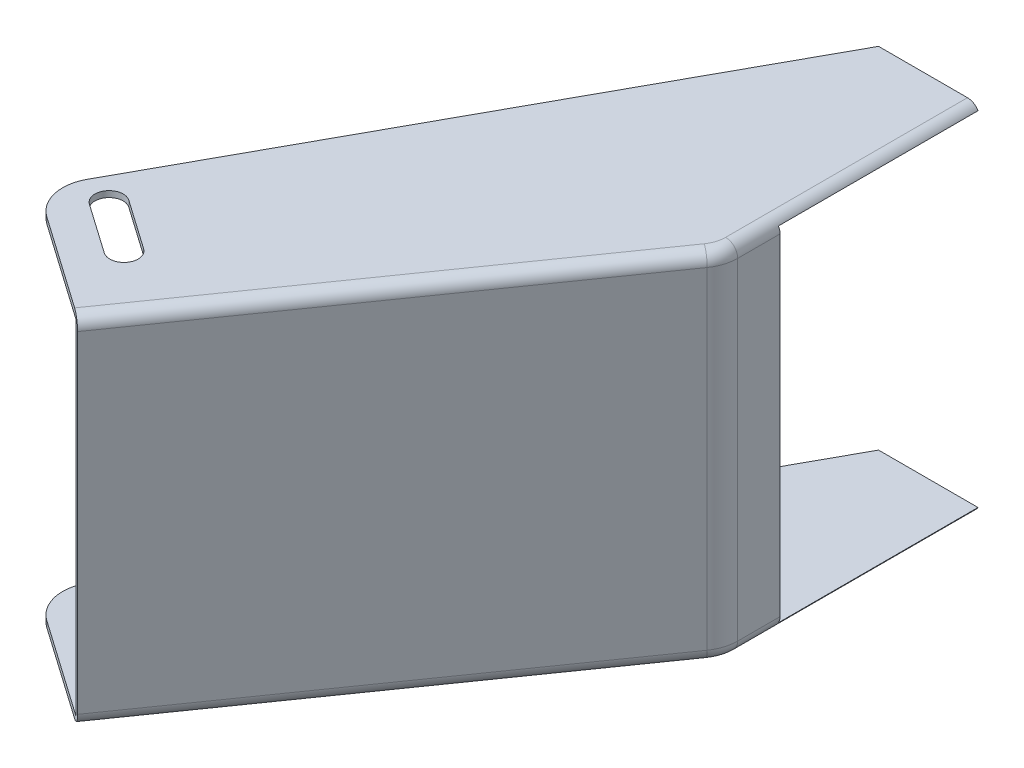
ISO-10303-21;
HEADER;
FILE_DESCRIPTION(('STEP AP214'),'2;1');
FILE_NAME('part.step','',(''),(''),'','','');
FILE_SCHEMA(('AUTOMOTIVE_DESIGN { 1 0 10303 214 1 1 1 1 }'));
ENDSEC;
DATA;
#1=APPLICATION_CONTEXT('core data for automotive mechanical design processes');
#2=APPLICATION_PROTOCOL_DEFINITION('international standard','automotive_design',2000,#1);
#3=PRODUCT_CONTEXT('',#1,'mechanical');
#4=PRODUCT('Part','Part','',(#3));
#5=PRODUCT_RELATED_PRODUCT_CATEGORY('part','',(#4));
#6=PRODUCT_DEFINITION_FORMATION('','',#4);
#7=PRODUCT_DEFINITION_CONTEXT('part definition',#1,'design');
#8=PRODUCT_DEFINITION('design','',#6,#7);
#9=PRODUCT_DEFINITION_SHAPE('','',#8);
#10=(LENGTH_UNIT() NAMED_UNIT(*) SI_UNIT(.MILLI.,.METRE.));
#11=(NAMED_UNIT(*) PLANE_ANGLE_UNIT() SI_UNIT($,.RADIAN.));
#12=(NAMED_UNIT(*) SI_UNIT($,.STERADIAN.) SOLID_ANGLE_UNIT());
#13=UNCERTAINTY_MEASURE_WITH_UNIT(LENGTH_MEASURE(1.E-05),#10,'distance_accuracy_value','');
#14=(GEOMETRIC_REPRESENTATION_CONTEXT(3) GLOBAL_UNCERTAINTY_ASSIGNED_CONTEXT((#13)) GLOBAL_UNIT_ASSIGNED_CONTEXT((#10,
#11,#12)) REPRESENTATION_CONTEXT('',''));
#15=CARTESIAN_POINT('',(0.,0.,0.));
#16=DIRECTION('',(0.,0.,1.));
#17=DIRECTION('',(1.,0.,0.));
#18=AXIS2_PLACEMENT_3D('',#15,#16,#17);
#19=CARTESIAN_POINT('',(-1.5,87.5,0.));
#20=DIRECTION('',(0.,0.,1.));
#21=DIRECTION('',(1.,0.,0.));
#22=AXIS2_PLACEMENT_3D('',#19,#20,#21);
#23=PLANE('',#22);
#24=CARTESIAN_POINT('',(-3.,85.,0.));
#25=DIRECTION('',(0.,0.,1.));
#26=DIRECTION('',(1.,0.,0.));
#27=AXIS2_PLACEMENT_3D('',#24,#25,#26);
#28=CIRCLE('',#27,3.);
#29=CARTESIAN_POINT('',(-3.,88.,0.));
#30=VERTEX_POINT('',#29);
#31=CARTESIAN_POINT('',(-0.401923788646688,86.5,0.));
#32=VERTEX_POINT('',#31);
#33=EDGE_CURVE('E310',#30,#32,#28,.F.);
#34=ORIENTED_EDGE('',*,*,#33,.T.);
#35=DIRECTION('',(1.,0.,0.));
#36=VECTOR('',#35,1.);
#37=CARTESIAN_POINT('',(0.,86.5,0.));
#38=LINE('',#37,#36);
#39=CARTESIAN_POINT('',(-25.,86.5,0.));
#40=VERTEX_POINT('',#39);
#41=EDGE_CURVE('E475',#40,#32,#38,.T.);
#42=ORIENTED_EDGE('',*,*,#41,.F.);
#43=DIRECTION('',(0.,1.,0.));
#44=VECTOR('',#43,1.);
#45=CARTESIAN_POINT('',(-25.,86.5,0.));
#46=LINE('',#45,#44);
#47=CARTESIAN_POINT('',(-25.,88.,0.));
#48=VERTEX_POINT('',#47);
#49=EDGE_CURVE('E460',#40,#48,#46,.T.);
#50=ORIENTED_EDGE('',*,*,#49,.T.);
#51=DIRECTION('',(1.,0.,0.));
#52=VECTOR('',#51,1.);
#53=CARTESIAN_POINT('',(0.,88.,0.));
#54=LINE('',#53,#52);
#55=EDGE_CURVE('E482',#48,#30,#54,.T.);
#56=ORIENTED_EDGE('',*,*,#55,.T.);
#57=EDGE_LOOP('',(#34,#42,#50,#56));
#58=FACE_BOUND('',#57,.T.);
#59=ADVANCED_FACE('F41',(#58),#23,.F.);
#60=DIRECTION('',(1.,0.,0.));
#61=VECTOR('',#60,1.);
#62=CARTESIAN_POINT('',(0.,1.5,0.));
#63=LINE('',#62,#61);
#64=CARTESIAN_POINT('',(-25.,1.5,0.));
#65=VERTEX_POINT('',#64);
#66=CARTESIAN_POINT('',(-0.401923788646688,1.5,0.));
#67=VERTEX_POINT('',#66);
#68=EDGE_CURVE('E364',#65,#67,#63,.T.);
#69=ORIENTED_EDGE('',*,*,#68,.T.);
#70=CARTESIAN_POINT('',(-3.,3.,0.));
#71=DIRECTION('',(0.,0.,1.));
#72=DIRECTION('',(1.,0.,0.));
#73=AXIS2_PLACEMENT_3D('',#70,#71,#72);
#74=CIRCLE('',#73,3.);
#75=CARTESIAN_POINT('',(-3.,0.,0.));
#76=VERTEX_POINT('',#75);
#77=EDGE_CURVE('E307',#67,#76,#74,.F.);
#78=ORIENTED_EDGE('',*,*,#77,.T.);
#79=DIRECTION('',(-1.,0.,0.));
#80=VECTOR('',#79,1.);
#81=CARTESIAN_POINT('',(-1.5,0.,0.));
#82=LINE('',#81,#80);
#83=CARTESIAN_POINT('',(-25.,0.,0.));
#84=VERTEX_POINT('',#83);
#85=EDGE_CURVE('E249',#76,#84,#82,.T.);
#86=ORIENTED_EDGE('',*,*,#85,.T.);
#87=DIRECTION('',(0.,-1.,0.));
#88=VECTOR('',#87,1.);
#89=CARTESIAN_POINT('',(-25.,1.5,0.));
#90=LINE('',#89,#88);
#91=EDGE_CURVE('E256',#65,#84,#90,.T.);
#92=ORIENTED_EDGE('',*,*,#91,.F.);
#93=EDGE_LOOP('',(#69,#78,#86,#92));
#94=FACE_BOUND('',#93,.T.);
#95=ADVANCED_FACE('F370',(#94),#23,.F.);
#96=CARTESIAN_POINT('',(-1.5,87.5,0.));
#97=DIRECTION('',(1.,0.,0.));
#98=DIRECTION('',(0.,0.,-1.));
#99=AXIS2_PLACEMENT_3D('',#96,#97,#98);
#100=PLANE('',#99);
#101=DIRECTION('',(0.,0.,-1.));
#102=VECTOR('',#101,1.);
#103=CARTESIAN_POINT('',(-1.5,86.5,0.));
#104=LINE('',#103,#102);
#105=CARTESIAN_POINT('',(-1.49999999999999,86.5,59.3740639278917));
#106=VERTEX_POINT('',#105);
#107=CARTESIAN_POINT('',(-1.5,86.5,49.3740639278917));
#108=VERTEX_POINT('',#107);
#109=EDGE_CURVE('E241',#106,#108,#104,.T.);
#110=ORIENTED_EDGE('',*,*,#109,.T.);
#111=DIRECTION('',(0.,1.,0.));
#112=VECTOR('',#111,1.);
#113=CARTESIAN_POINT('',(-1.5,86.5,49.3740639278917));
#114=LINE('',#113,#112);
#115=CARTESIAN_POINT('',(-1.5,1.5,49.3740639278917));
#116=VERTEX_POINT('',#115);
#117=EDGE_CURVE('E229',#116,#108,#114,.T.);
#118=ORIENTED_EDGE('',*,*,#117,.F.);
#119=DIRECTION('',(0.,0.,1.));
#120=VECTOR('',#119,1.);
#121=CARTESIAN_POINT('',(-1.5,1.5,0.));
#122=LINE('',#121,#120);
#123=CARTESIAN_POINT('',(-1.49999999999999,1.5,59.3740639278917));
#124=VERTEX_POINT('',#123);
#125=EDGE_CURVE('E238',#116,#124,#122,.T.);
#126=ORIENTED_EDGE('',*,*,#125,.T.);
#127=DIRECTION('',(0.,-1.,0.));
#128=VECTOR('',#127,1.);
#129=CARTESIAN_POINT('',(-1.49999999999999,86.5,59.3740639278917));
#130=LINE('',#129,#128);
#131=EDGE_CURVE('E285',#124,#106,#130,.F.);
#132=ORIENTED_EDGE('',*,*,#131,.T.);
#133=EDGE_LOOP('',(#110,#118,#126,#132));
#134=FACE_BOUND('',#133,.T.);
#135=ADVANCED_FACE('F237',(#134),#100,.F.);
#136=CARTESIAN_POINT('',(-1.49999999999999,87.5,62.5270518166815));
#137=DIRECTION('',(0.819152044288991,0.,0.573576436351047));
#138=DIRECTION('',(0.573576436351047,0.,-0.819152044288991));
#139=AXIS2_PLACEMENT_3D('',#136,#137,#138);
#140=PLANE('',#139);
#141=DIRECTION('',(0.573576436351047,0.,-0.819152044288991));
#142=VECTOR('',#141,1.);
#143=CARTESIAN_POINT('',(-1.49999999999999,86.5,62.5270518166815));
#144=LINE('',#143,#142);
#145=CARTESIAN_POINT('',(-67.1900182468039,86.5,156.342120438707));
#146=VERTEX_POINT('',#145);
#147=CARTESIAN_POINT('',(-3.30847955711008,86.5,65.1098282914022));
#148=VERTEX_POINT('',#147);
#149=EDGE_CURVE('E455',#146,#148,#144,.T.);
#150=ORIENTED_EDGE('',*,*,#149,.T.);
#151=DIRECTION('',(0.,-1.,0.));
#152=VECTOR('',#151,1.);
#153=CARTESIAN_POINT('',(-3.30847955711008,1.5,65.1098282914022));
#154=LINE('',#153,#152);
#155=CARTESIAN_POINT('',(-3.30847955711008,1.5,65.1098282914022));
#156=VERTEX_POINT('',#155);
#157=EDGE_CURVE('E279',#148,#156,#154,.T.);
#158=ORIENTED_EDGE('',*,*,#157,.T.);
#159=DIRECTION('',(-0.573576436351047,0.,0.819152044288991));
#160=VECTOR('',#159,1.);
#161=CARTESIAN_POINT('',(-1.49999999999999,1.5,62.5270518166815));
#162=LINE('',#161,#160);
#163=CARTESIAN_POINT('',(-67.1900182468039,1.5,156.342120438707));
#164=VERTEX_POINT('',#163);
#165=EDGE_CURVE('E250',#156,#164,#162,.T.);
#166=ORIENTED_EDGE('',*,*,#165,.T.);
#167=DIRECTION('',(0.,-1.,0.));
#168=VECTOR('',#167,1.);
#169=CARTESIAN_POINT('',(-67.1900182468039,87.5,156.342120438707));
#170=LINE('',#169,#168);
#171=EDGE_CURVE('E267',#146,#164,#170,.T.);
#172=ORIENTED_EDGE('',*,*,#171,.F.);
#173=EDGE_LOOP('',(#150,#158,#166,#172));
#174=FACE_BOUND('',#173,.T.);
#175=ADVANCED_FACE('F792',(#174),#140,.F.);
#176=CARTESIAN_POINT('',(-67.1900182468039,87.5,156.342120438707));
#177=DIRECTION('',(0.573576436351033,0.,-0.819152044289001));
#178=DIRECTION('',(-0.819152044289001,0.,-0.573576436351033));
#179=AXIS2_PLACEMENT_3D('',#176,#177,#178);
#180=PLANE('',#179);
#181=DIRECTION('',(0.819152044289001,0.,0.573576436351033));
#182=VECTOR('',#181,1.);
#183=CARTESIAN_POINT('',(-67.1900182468039,0.,156.342120438707));
#184=LINE('',#183,#182);
#185=CARTESIAN_POINT('',(-91.3810243701356,0.,139.403395594273));
#186=VERTEX_POINT('',#185);
#187=CARTESIAN_POINT('',(-68.4187463132374,0.,155.481755784181));
#188=VERTEX_POINT('',#187);
#189=EDGE_CURVE('E254',#186,#188,#184,.T.);
#190=ORIENTED_EDGE('',*,*,#189,.T.);
#191=CARTESIAN_POINT('',(-68.4187463132374,3.,155.481755784181));
#192=DIRECTION('',(0.573576436351033,0.,-0.819152044289001));
#193=DIRECTION('',(-0.819152044289001,0.,-0.573576436351033));
#194=AXIS2_PLACEMENT_3D('',#191,#192,#193);
#195=CIRCLE('',#194,3.);
#196=CARTESIAN_POINT('',(-65.9612901803704,3.,157.202485093234));
#197=VERTEX_POINT('',#196);
#198=EDGE_CURVE('E338',#188,#197,#195,.F.);
#199=ORIENTED_EDGE('',*,*,#198,.T.);
#200=DIRECTION('',(0.,-1.,0.));
#201=VECTOR('',#200,1.);
#202=CARTESIAN_POINT('',(-65.9612901803704,87.5,157.202485093234));
#203=LINE('',#202,#201);
#204=CARTESIAN_POINT('',(-65.9612901803704,85.,157.202485093234));
#205=VERTEX_POINT('',#204);
#206=EDGE_CURVE('E263',#205,#197,#203,.T.);
#207=ORIENTED_EDGE('',*,*,#206,.F.);
#208=CARTESIAN_POINT('',(-68.4187463132374,85.,155.481755784181));
#209=DIRECTION('',(0.573576436351033,0.,-0.819152044289001));
#210=DIRECTION('',(-0.819152044289001,0.,-0.573576436351033));
#211=AXIS2_PLACEMENT_3D('',#208,#209,#210);
#212=CIRCLE('',#211,3.);
#213=CARTESIAN_POINT('',(-68.4187463132374,88.,155.481755784181));
#214=VERTEX_POINT('',#213);
#215=EDGE_CURVE('E335',#205,#214,#212,.F.);
#216=ORIENTED_EDGE('',*,*,#215,.T.);
#217=DIRECTION('',(-0.819152044288991,0.,-0.573576436351047));
#218=VECTOR('',#217,1.);
#219=CARTESIAN_POINT('',(-91.3810243701356,88.,139.403395594273));
#220=LINE('',#219,#218);
#221=CARTESIAN_POINT('',(-91.3810243701356,88.,139.403395594273));
#222=VERTEX_POINT('',#221);
#223=EDGE_CURVE('E472',#214,#222,#220,.T.);
#224=ORIENTED_EDGE('',*,*,#223,.T.);
#225=DIRECTION('',(0.,1.,0.));
#226=VECTOR('',#225,1.);
#227=CARTESIAN_POINT('',(-91.3810243701356,86.5,139.403395594273));
#228=LINE('',#227,#226);
#229=CARTESIAN_POINT('',(-91.3810243701356,86.5,139.403395594273));
#230=VERTEX_POINT('',#229);
#231=EDGE_CURVE('E459',#230,#222,#228,.T.);
#232=ORIENTED_EDGE('',*,*,#231,.F.);
#233=DIRECTION('',(-0.819152044288991,0.,-0.573576436351047));
#234=VECTOR('',#233,1.);
#235=CARTESIAN_POINT('',(-91.3810243701356,86.5,139.403395594273));
#236=LINE('',#235,#234);
#237=EDGE_CURVE('E465',#146,#230,#236,.T.);
#238=ORIENTED_EDGE('',*,*,#237,.F.);
#239=ORIENTED_EDGE('',*,*,#171,.T.);
#240=DIRECTION('',(-0.819152044288991,0.,-0.573576436351047));
#241=VECTOR('',#240,1.);
#242=CARTESIAN_POINT('',(-91.3810243701356,1.5,139.403395594273));
#243=LINE('',#242,#241);
#244=CARTESIAN_POINT('',(-91.3810243701356,1.5,139.403395594273));
#245=VERTEX_POINT('',#244);
#246=EDGE_CURVE('E382',#164,#245,#243,.T.);
#247=ORIENTED_EDGE('',*,*,#246,.T.);
#248=DIRECTION('',(0.,-1.,0.));
#249=VECTOR('',#248,1.);
#250=CARTESIAN_POINT('',(-91.3810243701356,1.5,139.403395594273));
#251=LINE('',#250,#249);
#252=EDGE_CURVE('E396',#245,#186,#251,.T.);
#253=ORIENTED_EDGE('',*,*,#252,.T.);
#254=EDGE_LOOP('',(#190,#199,#207,#216,#224,#232,#238,#239,#247,#253));
#255=FACE_BOUND('',#254,.T.);
#256=ADVANCED_FACE('F567',(#255),#180,.F.);
#257=CARTESIAN_POINT('',(0.,87.5,63.));
#258=DIRECTION('',(-0.819152044288991,0.,-0.573576436351047));
#259=DIRECTION('',(-0.573576436351047,0.,0.819152044288991));
#260=AXIS2_PLACEMENT_3D('',#257,#258,#259);
#261=PLANE('',#260);
#262=ORIENTED_EDGE('',*,*,#206,.T.);
#263=DIRECTION('',(0.573576436351047,0.,-0.819152044288991));
#264=VECTOR('',#263,1.);
#265=CARTESIAN_POINT('',(-1.80847955711009,3.,65.5827764747206));
#266=LINE('',#265,#264);
#267=CARTESIAN_POINT('',(-1.80847955711009,3.,65.5827764747206));
#268=VERTEX_POINT('',#267);
#269=EDGE_CURVE('E323',#197,#268,#266,.T.);
#270=ORIENTED_EDGE('',*,*,#269,.T.);
#271=DIRECTION('',(0.,-1.,0.));
#272=VECTOR('',#271,1.);
#273=CARTESIAN_POINT('',(-1.80847955711009,87.5,65.5827764747206));
#274=LINE('',#273,#272);
#275=CARTESIAN_POINT('',(-1.80847955711009,85.,65.5827764747206));
#276=VERTEX_POINT('',#275);
#277=EDGE_CURVE('E275',#268,#276,#274,.F.);
#278=ORIENTED_EDGE('',*,*,#277,.T.);
#279=DIRECTION('',(-0.573576436351047,0.,0.819152044288991));
#280=VECTOR('',#279,1.);
#281=CARTESIAN_POINT('',(0.,85.,63.));
#282=LINE('',#281,#280);
#283=EDGE_CURVE('E320',#276,#205,#282,.T.);
#284=ORIENTED_EDGE('',*,*,#283,.T.);
#285=EDGE_LOOP('',(#262,#270,#278,#284));
#286=FACE_BOUND('',#285,.T.);
#287=ADVANCED_FACE('F561',(#286),#261,.F.);
#288=CARTESIAN_POINT('',(0.,87.5,0.));
#289=DIRECTION('',(-1.,0.,0.));
#290=DIRECTION('',(0.,0.,1.));
#291=AXIS2_PLACEMENT_3D('',#288,#289,#290);
#292=PLANE('',#291);
#293=DIRECTION('',(0.,0.,-1.));
#294=VECTOR('',#293,1.);
#295=CARTESIAN_POINT('',(0.,3.,0.));
#296=LINE('',#295,#294);
#297=CARTESIAN_POINT('',(0.,3.,59.8470121112102));
#298=VERTEX_POINT('',#297);
#299=CARTESIAN_POINT('',(0.,3.,49.3740639278917));
#300=VERTEX_POINT('',#299);
#301=EDGE_CURVE('E291',#298,#300,#296,.T.);
#302=ORIENTED_EDGE('',*,*,#301,.T.);
#303=DIRECTION('',(0.,-1.,0.));
#304=VECTOR('',#303,1.);
#305=CARTESIAN_POINT('',(0.,86.5,49.3740639278917));
#306=LINE('',#305,#304);
#307=CARTESIAN_POINT('',(0.,85.,49.3740639278917));
#308=VERTEX_POINT('',#307);
#309=EDGE_CURVE('E539',#308,#300,#306,.T.);
#310=ORIENTED_EDGE('',*,*,#309,.F.);
#311=DIRECTION('',(0.,0.,1.));
#312=VECTOR('',#311,1.);
#313=CARTESIAN_POINT('',(0.,85.,0.));
#314=LINE('',#313,#312);
#315=CARTESIAN_POINT('',(0.,85.,59.8470121112102));
#316=VERTEX_POINT('',#315);
#317=EDGE_CURVE('E295',#308,#316,#314,.T.);
#318=ORIENTED_EDGE('',*,*,#317,.T.);
#319=DIRECTION('',(0.,-1.,0.));
#320=VECTOR('',#319,1.);
#321=CARTESIAN_POINT('',(0.,87.5,59.8470121112102));
#322=LINE('',#321,#320);
#323=EDGE_CURVE('E271',#316,#298,#322,.T.);
#324=ORIENTED_EDGE('',*,*,#323,.T.);
#325=EDGE_LOOP('',(#302,#310,#318,#324));
#326=FACE_BOUND('',#325,.T.);
#327=ADVANCED_FACE('F549',(#326),#292,.F.);
#328=CARTESIAN_POINT('',(0.,0.,0.));
#329=DIRECTION('',(0.,-1.,0.));
#330=DIRECTION('',(0.,0.,-1.));
#331=AXIS2_PLACEMENT_3D('',#328,#329,#330);
#332=PLANE('',#331);
#333=CARTESIAN_POINT('',(-10.,0.,59.8470121112102));
#334=DIRECTION('',(0.,-1.,0.));
#335=DIRECTION('',(0.,0.,-1.));
#336=AXIS2_PLACEMENT_3D('',#333,#334,#335);
#337=CIRCLE('',#336,7.);
#338=CARTESIAN_POINT('',(-3.,0.,59.8470121112102));
#339=VERTEX_POINT('',#338);
#340=CARTESIAN_POINT('',(-4.26593568997706,0.,63.8620471656675));
#341=VERTEX_POINT('',#340);
#342=EDGE_CURVE('E65',#339,#341,#337,.T.);
#343=ORIENTED_EDGE('',*,*,#342,.T.);
#344=DIRECTION('',(0.573576436351047,0.,-0.819152044288991));
#345=VECTOR('',#344,1.);
#346=CARTESIAN_POINT('',(-68.4187463132374,0.,155.481755784181));
#347=LINE('',#346,#345);
#348=EDGE_CURVE('E332',#341,#188,#347,.F.);
#349=ORIENTED_EDGE('',*,*,#348,.T.);
#350=ORIENTED_EDGE('',*,*,#189,.F.);
#351=CARTESIAN_POINT('',(-85.6452600066251,0.,131.211875151383));
#352=DIRECTION('',(0.,-1.,0.));
#353=DIRECTION('',(0.,0.,1.));
#354=AXIS2_PLACEMENT_3D('',#351,#352,#353);
#355=CIRCLE('',#354,9.99999999999999);
#356=CARTESIAN_POINT('',(-94.4105961681687,0.,126.398468667911));
#357=VERTEX_POINT('',#356);
#358=EDGE_CURVE('E379',#186,#357,#355,.T.);
#359=ORIENTED_EDGE('',*,*,#358,.T.);
#360=DIRECTION('',(0.481340648347272,0.,-0.876533616154354));
#361=VECTOR('',#360,1.);
#362=CARTESIAN_POINT('',(-25.,0.,0.));
#363=LINE('',#362,#361);
#364=EDGE_CURVE('E377',#357,#84,#363,.T.);
#365=ORIENTED_EDGE('',*,*,#364,.T.);
#366=ORIENTED_EDGE('',*,*,#85,.F.);
#367=DIRECTION('',(0.,0.,-1.));
#368=VECTOR('',#367,1.);
#369=CARTESIAN_POINT('',(-3.,0.,59.8470121112102));
#370=LINE('',#369,#368);
#371=EDGE_CURVE('E327',#76,#339,#370,.F.);
#372=ORIENTED_EDGE('',*,*,#371,.T.);
#373=EDGE_LOOP('',(#343,#349,#350,#359,#365,#366,#372));
#374=FACE_BOUND('',#373,.T.);
#375=DIRECTION('',(-0.81915204428899,0.,-0.573576436351048));
#376=VECTOR('',#375,1.);
#377=CARTESIAN_POINT('',(-76.5269915089084,0.,140.038104666428));
#378=LINE('',#377,#376);
#379=CARTESIAN_POINT('',(-76.5269915089084,0.,140.038104666428));
#380=VERTEX_POINT('',#379);
#381=CARTESIAN_POINT('',(-88.8142721732432,0.,131.434458121162));
#382=VERTEX_POINT('',#381);
#383=EDGE_CURVE('E432',#380,#382,#378,.T.);
#384=ORIENTED_EDGE('',*,*,#383,.F.);
#385=CARTESIAN_POINT('',(-74.5194739816797,0.,137.171072511416));
#386=DIRECTION('',(0.,-1.,0.));
#387=DIRECTION('',(0.,0.,-1.));
#388=AXIS2_PLACEMENT_3D('',#385,#386,#387);
#389=CIRCLE('',#388,3.5);
#390=CARTESIAN_POINT('',(-72.511956454451,0.,134.304040356405));
#391=VERTEX_POINT('',#390);
#392=EDGE_CURVE('E436',#391,#380,#389,.T.);
#393=ORIENTED_EDGE('',*,*,#392,.F.);
#394=DIRECTION('',(0.819152044288992,0.,0.573576436351046));
#395=VECTOR('',#394,1.);
#396=CARTESIAN_POINT('',(-72.511956454451,0.,134.304040356405));
#397=LINE('',#396,#395);
#398=CARTESIAN_POINT('',(-84.7992371187859,0.,125.700393811139));
#399=VERTEX_POINT('',#398);
#400=EDGE_CURVE('E423',#399,#391,#397,.T.);
#401=ORIENTED_EDGE('',*,*,#400,.F.);
#402=CARTESIAN_POINT('',(-86.8067546460146,0.,128.56742596615));
#403=DIRECTION('',(0.,-1.,0.));
#404=DIRECTION('',(0.,0.,-1.));
#405=AXIS2_PLACEMENT_3D('',#402,#403,#404);
#406=CIRCLE('',#405,3.49999999999998);
#407=EDGE_CURVE('E428',#382,#399,#406,.T.);
#408=ORIENTED_EDGE('',*,*,#407,.F.);
#409=EDGE_LOOP('',(#384,#393,#401,#408));
#410=FACE_BOUND('',#409,.T.);
#411=ADVANCED_FACE('F373',(#374,#410),#332,.T.);
#412=CARTESIAN_POINT('',(-85.6452600066251,1.5,131.211875151383));
#413=DIRECTION('',(0.,1.,0.));
#414=DIRECTION('',(0.,0.,1.));
#415=AXIS2_PLACEMENT_3D('',#412,#413,#414);
#416=PLANE('',#415);
#417=CARTESIAN_POINT('',(-74.5194739816797,1.5,137.171072511416));
#418=DIRECTION('',(0.,-1.,0.));
#419=DIRECTION('',(0.,0.,-1.));
#420=AXIS2_PLACEMENT_3D('',#417,#418,#419);
#421=CIRCLE('',#420,3.5);
#422=CARTESIAN_POINT('',(-72.511956454451,1.5,134.304040356405));
#423=VERTEX_POINT('',#422);
#424=CARTESIAN_POINT('',(-76.5269915089084,1.5,140.038104666428));
#425=VERTEX_POINT('',#424);
#426=EDGE_CURVE('E427',#423,#425,#421,.T.);
#427=ORIENTED_EDGE('',*,*,#426,.T.);
#428=DIRECTION('',(-0.81915204428899,0.,-0.573576436351048));
#429=VECTOR('',#428,1.);
#430=CARTESIAN_POINT('',(-76.5269915089084,1.5,140.038104666428));
#431=LINE('',#430,#429);
#432=CARTESIAN_POINT('',(-88.8142721732432,1.5,131.434458121162));
#433=VERTEX_POINT('',#432);
#434=EDGE_CURVE('E446',#425,#433,#431,.T.);
#435=ORIENTED_EDGE('',*,*,#434,.T.);
#436=CARTESIAN_POINT('',(-86.8067546460146,1.5,128.56742596615));
#437=DIRECTION('',(0.,-1.,0.));
#438=DIRECTION('',(0.,0.,-1.));
#439=AXIS2_PLACEMENT_3D('',#436,#437,#438);
#440=CIRCLE('',#439,3.49999999999998);
#441=CARTESIAN_POINT('',(-84.7992371187859,1.5,125.700393811139));
#442=VERTEX_POINT('',#441);
#443=EDGE_CURVE('E442',#433,#442,#440,.T.);
#444=ORIENTED_EDGE('',*,*,#443,.T.);
#445=DIRECTION('',(0.819152044288992,0.,0.573576436351046));
#446=VECTOR('',#445,1.);
#447=CARTESIAN_POINT('',(-72.511956454451,1.5,134.304040356405));
#448=LINE('',#447,#446);
#449=EDGE_CURVE('E415',#442,#423,#448,.T.);
#450=ORIENTED_EDGE('',*,*,#449,.T.);
#451=EDGE_LOOP('',(#427,#435,#444,#450));
#452=FACE_BOUND('',#451,.T.);
#453=ORIENTED_EDGE('',*,*,#165,.F.);
#454=CARTESIAN_POINT('',(-11.5,1.5,59.3740639278917));
#455=DIRECTION('',(0.,1.,0.));
#456=DIRECTION('',(0.,0.,1.));
#457=AXIS2_PLACEMENT_3D('',#454,#455,#456);
#458=CIRCLE('',#457,10.);
#459=EDGE_CURVE('E246',#156,#124,#458,.T.);
#460=ORIENTED_EDGE('',*,*,#459,.T.);
#461=ORIENTED_EDGE('',*,*,#125,.F.);
#462=DIRECTION('',(-1.,0.,0.));
#463=VECTOR('',#462,1.);
#464=CARTESIAN_POINT('',(98.299533003751,1.5,49.3740639278917));
#465=LINE('',#464,#463);
#466=CARTESIAN_POINT('',(-0.401923788646685,1.5,49.3740639278917));
#467=VERTEX_POINT('',#466);
#468=EDGE_CURVE('E57',#467,#116,#465,.T.);
#469=ORIENTED_EDGE('',*,*,#468,.F.);
#470=DIRECTION('',(0.,0.,1.));
#471=VECTOR('',#470,1.);
#472=CARTESIAN_POINT('',(-0.401923788646685,1.5,0.));
#473=LINE('',#472,#471);
#474=EDGE_CURVE('E341',#467,#67,#473,.F.);
#475=ORIENTED_EDGE('',*,*,#474,.T.);
#476=ORIENTED_EDGE('',*,*,#68,.F.);
#477=DIRECTION('',(0.481340648347272,0.,-0.876533616154354));
#478=VECTOR('',#477,1.);
#479=CARTESIAN_POINT('',(-25.,1.5,0.));
#480=LINE('',#479,#478);
#481=CARTESIAN_POINT('',(-94.4105961681687,1.5,126.398468667911));
#482=VERTEX_POINT('',#481);
#483=EDGE_CURVE('E402',#482,#65,#480,.T.);
#484=ORIENTED_EDGE('',*,*,#483,.F.);
#485=CARTESIAN_POINT('',(-85.6452600066251,1.5,131.211875151383));
#486=DIRECTION('',(0.,-1.,0.));
#487=DIRECTION('',(0.,0.,1.));
#488=AXIS2_PLACEMENT_3D('',#485,#486,#487);
#489=CIRCLE('',#488,9.99999999999999);
#490=EDGE_CURVE('E386',#245,#482,#489,.T.);
#491=ORIENTED_EDGE('',*,*,#490,.F.);
#492=ORIENTED_EDGE('',*,*,#246,.F.);
#493=EDGE_LOOP('',(#453,#460,#461,#469,#475,#476,#484,#491,#492));
#494=FACE_BOUND('',#493,.T.);
#495=ADVANCED_FACE('F245',(#452,#494),#416,.T.);
#496=CARTESIAN_POINT('',(-25.,1.5,0.));
#497=DIRECTION('',(-0.876533616154354,0.,-0.481340648347272));
#498=DIRECTION('',(-0.481340648347272,0.,0.876533616154354));
#499=AXIS2_PLACEMENT_3D('',#496,#497,#498);
#500=PLANE('',#499);
#501=ORIENTED_EDGE('',*,*,#364,.F.);
#502=DIRECTION('',(0.,-1.,0.));
#503=VECTOR('',#502,1.);
#504=CARTESIAN_POINT('',(-94.4105961681687,1.5,126.398468667911));
#505=LINE('',#504,#503);
#506=EDGE_CURVE('E394',#482,#357,#505,.T.);
#507=ORIENTED_EDGE('',*,*,#506,.F.);
#508=ORIENTED_EDGE('',*,*,#483,.T.);
#509=ORIENTED_EDGE('',*,*,#91,.T.);
#510=EDGE_LOOP('',(#501,#507,#508,#509));
#511=FACE_BOUND('',#510,.T.);
#512=ADVANCED_FACE('F597',(#511),#500,.T.);
#513=CARTESIAN_POINT('',(-85.6452600066251,1.5,131.211875151383));
#514=DIRECTION('',(0.,-1.,0.));
#515=DIRECTION('',(0.,0.,-1.));
#516=AXIS2_PLACEMENT_3D('',#513,#514,#515);
#517=CYLINDRICAL_SURFACE('',#516,9.99999999999999);
#518=ORIENTED_EDGE('',*,*,#358,.F.);
#519=ORIENTED_EDGE('',*,*,#252,.F.);
#520=ORIENTED_EDGE('',*,*,#490,.T.);
#521=ORIENTED_EDGE('',*,*,#506,.T.);
#522=EDGE_LOOP('',(#518,#519,#520,#521));
#523=FACE_BOUND('',#522,.T.);
#524=ADVANCED_FACE('F596',(#523),#517,.T.);
#525=CARTESIAN_POINT('',(-74.5194739816797,1.5,137.171072511416));
#526=DIRECTION('',(0.,-1.,0.));
#527=DIRECTION('',(0.,0.,-1.));
#528=AXIS2_PLACEMENT_3D('',#525,#526,#527);
#529=CYLINDRICAL_SURFACE('',#528,3.5);
#530=ORIENTED_EDGE('',*,*,#392,.T.);
#531=DIRECTION('',(0.,-1.,0.));
#532=VECTOR('',#531,1.);
#533=CARTESIAN_POINT('',(-76.5269915089084,1.5,140.038104666428));
#534=LINE('',#533,#532);
#535=EDGE_CURVE('E410',#425,#380,#534,.T.);
#536=ORIENTED_EDGE('',*,*,#535,.F.);
#537=ORIENTED_EDGE('',*,*,#426,.F.);
#538=DIRECTION('',(0.,-1.,0.));
#539=VECTOR('',#538,1.);
#540=CARTESIAN_POINT('',(-72.511956454451,1.5,134.304040356405));
#541=LINE('',#540,#539);
#542=EDGE_CURVE('E388',#423,#391,#541,.T.);
#543=ORIENTED_EDGE('',*,*,#542,.T.);
#544=EDGE_LOOP('',(#530,#536,#537,#543));
#545=FACE_BOUND('',#544,.T.);
#546=ADVANCED_FACE('F604',(#545),#529,.F.);
#547=CARTESIAN_POINT('',(-72.511956454451,1.5,134.304040356405));
#548=DIRECTION('',(0.573576436351046,0.,-0.819152044288992));
#549=DIRECTION('',(-0.819152044288992,0.,-0.573576436351046));
#550=AXIS2_PLACEMENT_3D('',#547,#548,#549);
#551=PLANE('',#550);
#552=ORIENTED_EDGE('',*,*,#400,.T.);
#553=ORIENTED_EDGE('',*,*,#542,.F.);
#554=ORIENTED_EDGE('',*,*,#449,.F.);
#555=DIRECTION('',(0.,-1.,0.));
#556=VECTOR('',#555,1.);
#557=CARTESIAN_POINT('',(-84.7992371187859,1.5,125.700393811139));
#558=LINE('',#557,#556);
#559=EDGE_CURVE('E418',#442,#399,#558,.T.);
#560=ORIENTED_EDGE('',*,*,#559,.T.);
#561=EDGE_LOOP('',(#552,#553,#554,#560));
#562=FACE_BOUND('',#561,.T.);
#563=ADVANCED_FACE('F739',(#562),#551,.F.);
#564=CARTESIAN_POINT('',(-86.8067546460146,1.5,128.56742596615));
#565=DIRECTION('',(0.,-1.,0.));
#566=DIRECTION('',(0.,0.,-1.));
#567=AXIS2_PLACEMENT_3D('',#564,#565,#566);
#568=CYLINDRICAL_SURFACE('',#567,3.49999999999998);
#569=ORIENTED_EDGE('',*,*,#407,.T.);
#570=ORIENTED_EDGE('',*,*,#559,.F.);
#571=ORIENTED_EDGE('',*,*,#443,.F.);
#572=DIRECTION('',(0.,-1.,0.));
#573=VECTOR('',#572,1.);
#574=CARTESIAN_POINT('',(-88.8142721732432,1.5,131.434458121162));
#575=LINE('',#574,#573);
#576=EDGE_CURVE('E414',#433,#382,#575,.T.);
#577=ORIENTED_EDGE('',*,*,#576,.T.);
#578=EDGE_LOOP('',(#569,#570,#571,#577));
#579=FACE_BOUND('',#578,.T.);
#580=ADVANCED_FACE('F731',(#579),#568,.F.);
#581=CARTESIAN_POINT('',(-76.5269915089084,1.5,140.038104666428));
#582=DIRECTION('',(-0.573576436351048,0.,0.81915204428899));
#583=DIRECTION('',(0.81915204428899,0.,0.573576436351048));
#584=AXIS2_PLACEMENT_3D('',#581,#582,#583);
#585=PLANE('',#584);
#586=ORIENTED_EDGE('',*,*,#383,.T.);
#587=ORIENTED_EDGE('',*,*,#576,.F.);
#588=ORIENTED_EDGE('',*,*,#434,.F.);
#589=ORIENTED_EDGE('',*,*,#535,.T.);
#590=EDGE_LOOP('',(#586,#587,#588,#589));
#591=FACE_BOUND('',#590,.T.);
#592=ADVANCED_FACE('F723',(#591),#585,.F.);
#593=CARTESIAN_POINT('',(-85.6452600066251,86.5,131.211875151383));
#594=DIRECTION('',(0.,-1.,0.));
#595=DIRECTION('',(0.,0.,1.));
#596=AXIS2_PLACEMENT_3D('',#593,#594,#595);
#597=PLANE('',#596);
#598=DIRECTION('',(-0.81915204428899,0.,-0.573576436351048));
#599=VECTOR('',#598,1.);
#600=CARTESIAN_POINT('',(-76.5269915089084,86.5,140.038104666428));
#601=LINE('',#600,#599);
#602=CARTESIAN_POINT('',(-76.5269915089084,86.5,140.038104666428));
#603=VERTEX_POINT('',#602);
#604=CARTESIAN_POINT('',(-88.8142721732432,86.5,131.434458121162));
#605=VERTEX_POINT('',#604);
#606=EDGE_CURVE('E502',#603,#605,#601,.T.);
#607=ORIENTED_EDGE('',*,*,#606,.F.);
#608=CARTESIAN_POINT('',(-74.5194739816797,86.5,137.171072511416));
#609=DIRECTION('',(0.,-1.,0.));
#610=DIRECTION('',(0.,0.,-1.));
#611=AXIS2_PLACEMENT_3D('',#608,#609,#610);
#612=CIRCLE('',#611,3.5);
#613=CARTESIAN_POINT('',(-72.511956454451,86.5,134.304040356405));
#614=VERTEX_POINT('',#613);
#615=EDGE_CURVE('E515',#614,#603,#612,.T.);
#616=ORIENTED_EDGE('',*,*,#615,.F.);
#617=DIRECTION('',(0.819152044288992,0.,0.573576436351046));
#618=VECTOR('',#617,1.);
#619=CARTESIAN_POINT('',(-72.511956454451,86.5,134.304040356405));
#620=LINE('',#619,#618);
#621=CARTESIAN_POINT('',(-84.7992371187859,86.5,125.700393811139));
#622=VERTEX_POINT('',#621);
#623=EDGE_CURVE('E533',#622,#614,#620,.T.);
#624=ORIENTED_EDGE('',*,*,#623,.F.);
#625=CARTESIAN_POINT('',(-86.8067546460146,86.5,128.56742596615));
#626=DIRECTION('',(0.,-1.,0.));
#627=DIRECTION('',(0.,0.,-1.));
#628=AXIS2_PLACEMENT_3D('',#625,#626,#627);
#629=CIRCLE('',#628,3.49999999999998);
#630=EDGE_CURVE('E529',#605,#622,#629,.T.);
#631=ORIENTED_EDGE('',*,*,#630,.F.);
#632=EDGE_LOOP('',(#607,#616,#624,#631));
#633=FACE_BOUND('',#632,.T.);
#634=ORIENTED_EDGE('',*,*,#109,.F.);
#635=CARTESIAN_POINT('',(-11.5,86.5,59.3740639278917));
#636=DIRECTION('',(0.,-1.,0.));
#637=DIRECTION('',(0.,0.,-1.));
#638=AXIS2_PLACEMENT_3D('',#635,#636,#637);
#639=CIRCLE('',#638,10.);
#640=EDGE_CURVE('E288',#106,#148,#639,.T.);
#641=ORIENTED_EDGE('',*,*,#640,.T.);
#642=ORIENTED_EDGE('',*,*,#149,.F.);
#643=ORIENTED_EDGE('',*,*,#237,.T.);
#644=CARTESIAN_POINT('',(-85.6452600066251,86.5,131.211875151383));
#645=DIRECTION('',(0.,-1.,0.));
#646=DIRECTION('',(0.,0.,1.));
#647=AXIS2_PLACEMENT_3D('',#644,#645,#646);
#648=CIRCLE('',#647,9.99999999999999);
#649=CARTESIAN_POINT('',(-94.4105961681687,86.5,126.398468667911));
#650=VERTEX_POINT('',#649);
#651=EDGE_CURVE('E489',#230,#650,#648,.T.);
#652=ORIENTED_EDGE('',*,*,#651,.T.);
#653=DIRECTION('',(0.481340648347272,0.,-0.876533616154354));
#654=VECTOR('',#653,1.);
#655=CARTESIAN_POINT('',(-25.,86.5,0.));
#656=LINE('',#655,#654);
#657=EDGE_CURVE('E492',#650,#40,#656,.T.);
#658=ORIENTED_EDGE('',*,*,#657,.T.);
#659=ORIENTED_EDGE('',*,*,#41,.T.);
#660=DIRECTION('',(0.,0.,1.));
#661=VECTOR('',#660,1.);
#662=CARTESIAN_POINT('',(-0.401923788646685,86.5,0.));
#663=LINE('',#662,#661);
#664=CARTESIAN_POINT('',(-0.401923788646685,86.5,49.3740639278917));
#665=VERTEX_POINT('',#664);
#666=EDGE_CURVE('E11',#32,#665,#663,.T.);
#667=ORIENTED_EDGE('',*,*,#666,.T.);
#668=DIRECTION('',(-1.,0.,0.));
#669=VECTOR('',#668,1.);
#670=CARTESIAN_POINT('',(98.299533003751,86.5,49.3740639278917));
#671=LINE('',#670,#669);
#672=EDGE_CURVE('E234',#665,#108,#671,.T.);
#673=ORIENTED_EDGE('',*,*,#672,.T.);
#674=EDGE_LOOP('',(#634,#641,#642,#643,#652,#658,#659,#667,#673));
#675=FACE_BOUND('',#674,.T.);
#676=ADVANCED_FACE('F589',(#633,#675),#597,.T.);
#677=CARTESIAN_POINT('',(-85.6452600066251,88.,131.211875151383));
#678=DIRECTION('',(0.,-1.,0.));
#679=DIRECTION('',(0.,0.,1.));
#680=AXIS2_PLACEMENT_3D('',#677,#678,#679);
#681=PLANE('',#680);
#682=CARTESIAN_POINT('',(-10.,88.,59.8470121112102));
#683=DIRECTION('',(0.,-1.,0.));
#684=DIRECTION('',(0.,0.,-1.));
#685=AXIS2_PLACEMENT_3D('',#682,#683,#684);
#686=CIRCLE('',#685,7.);
#687=CARTESIAN_POINT('',(-4.26593568997706,88.,63.8620471656675));
#688=VERTEX_POINT('',#687);
#689=CARTESIAN_POINT('',(-3.,88.,59.8470121112102));
#690=VERTEX_POINT('',#689);
#691=EDGE_CURVE('E301',#688,#690,#686,.F.);
#692=ORIENTED_EDGE('',*,*,#691,.T.);
#693=DIRECTION('',(0.,0.,1.));
#694=VECTOR('',#693,1.);
#695=CARTESIAN_POINT('',(-3.,88.,131.211875151383));
#696=LINE('',#695,#694);
#697=EDGE_CURVE('E304',#690,#30,#696,.F.);
#698=ORIENTED_EDGE('',*,*,#697,.T.);
#699=ORIENTED_EDGE('',*,*,#55,.F.);
#700=DIRECTION('',(0.481340648347272,0.,-0.876533616154354));
#701=VECTOR('',#700,1.);
#702=CARTESIAN_POINT('',(-25.,88.,0.));
#703=LINE('',#702,#701);
#704=CARTESIAN_POINT('',(-94.4105961681687,88.,126.398468667911));
#705=VERTEX_POINT('',#704);
#706=EDGE_CURVE('E479',#705,#48,#703,.T.);
#707=ORIENTED_EDGE('',*,*,#706,.F.);
#708=CARTESIAN_POINT('',(-85.6452600066251,88.,131.211875151383));
#709=DIRECTION('',(0.,-1.,0.));
#710=DIRECTION('',(0.,0.,1.));
#711=AXIS2_PLACEMENT_3D('',#708,#709,#710);
#712=CIRCLE('',#711,9.99999999999999);
#713=EDGE_CURVE('E476',#222,#705,#712,.T.);
#714=ORIENTED_EDGE('',*,*,#713,.F.);
#715=ORIENTED_EDGE('',*,*,#223,.F.);
#716=DIRECTION('',(-0.573576436351047,0.,0.819152044288991));
#717=VECTOR('',#716,1.);
#718=CARTESIAN_POINT('',(-62.6829819497269,88.,147.290235341291));
#719=LINE('',#718,#717);
#720=EDGE_CURVE('E298',#214,#688,#719,.F.);
#721=ORIENTED_EDGE('',*,*,#720,.T.);
#722=EDGE_LOOP('',(#692,#698,#699,#707,#714,#715,#721));
#723=FACE_BOUND('',#722,.T.);
#724=CARTESIAN_POINT('',(-74.5194739816797,88.,137.171072511416));
#725=DIRECTION('',(0.,-1.,0.));
#726=DIRECTION('',(0.,0.,-1.));
#727=AXIS2_PLACEMENT_3D('',#724,#725,#726);
#728=CIRCLE('',#727,3.5);
#729=CARTESIAN_POINT('',(-72.511956454451,88.,134.304040356405));
#730=VERTEX_POINT('',#729);
#731=CARTESIAN_POINT('',(-76.5269915089084,88.,140.038104666428));
#732=VERTEX_POINT('',#731);
#733=EDGE_CURVE('E351',#730,#732,#728,.T.);
#734=ORIENTED_EDGE('',*,*,#733,.T.);
#735=DIRECTION('',(-0.81915204428899,0.,-0.573576436351048));
#736=VECTOR('',#735,1.);
#737=CARTESIAN_POINT('',(-76.5269915089084,88.,140.038104666428));
#738=LINE('',#737,#736);
#739=CARTESIAN_POINT('',(-88.8142721732432,88.,131.434458121162));
#740=VERTEX_POINT('',#739);
#741=EDGE_CURVE('E511',#732,#740,#738,.T.);
#742=ORIENTED_EDGE('',*,*,#741,.T.);
#743=CARTESIAN_POINT('',(-86.8067546460146,88.,128.56742596615));
#744=DIRECTION('',(0.,-1.,0.));
#745=DIRECTION('',(0.,0.,-1.));
#746=AXIS2_PLACEMENT_3D('',#743,#744,#745);
#747=CIRCLE('',#746,3.49999999999998);
#748=CARTESIAN_POINT('',(-84.7992371187859,88.,125.700393811139));
#749=VERTEX_POINT('',#748);
#750=EDGE_CURVE('E516',#740,#749,#747,.T.);
#751=ORIENTED_EDGE('',*,*,#750,.T.);
#752=DIRECTION('',(0.819152044288992,0.,0.573576436351046));
#753=VECTOR('',#752,1.);
#754=CARTESIAN_POINT('',(-72.511956454451,88.,134.304040356405));
#755=LINE('',#754,#753);
#756=EDGE_CURVE('E520',#749,#730,#755,.T.);
#757=ORIENTED_EDGE('',*,*,#756,.T.);
#758=EDGE_LOOP('',(#734,#742,#751,#757));
#759=FACE_BOUND('',#758,.T.);
#760=ADVANCED_FACE('F576',(#723,#759),#681,.F.);
#761=CARTESIAN_POINT('',(-85.6452600066251,86.5,131.211875151383));
#762=DIRECTION('',(0.,1.,0.));
#763=DIRECTION('',(0.,0.,1.));
#764=AXIS2_PLACEMENT_3D('',#761,#762,#763);
#765=CYLINDRICAL_SURFACE('',#764,9.99999999999999);
#766=ORIENTED_EDGE('',*,*,#713,.T.);
#767=DIRECTION('',(0.,1.,0.));
#768=VECTOR('',#767,1.);
#769=CARTESIAN_POINT('',(-94.4105961681687,86.5,126.398468667911));
#770=LINE('',#769,#768);
#771=EDGE_CURVE('E464',#650,#705,#770,.T.);
#772=ORIENTED_EDGE('',*,*,#771,.F.);
#773=ORIENTED_EDGE('',*,*,#651,.F.);
#774=ORIENTED_EDGE('',*,*,#231,.T.);
#775=EDGE_LOOP('',(#766,#772,#773,#774));
#776=FACE_BOUND('',#775,.T.);
#777=ADVANCED_FACE('F585',(#776),#765,.T.);
#778=CARTESIAN_POINT('',(-25.,86.5,0.));
#779=DIRECTION('',(0.876533616154354,0.,0.481340648347272));
#780=DIRECTION('',(0.481340648347272,0.,-0.876533616154354));
#781=AXIS2_PLACEMENT_3D('',#778,#779,#780);
#782=PLANE('',#781);
#783=ORIENTED_EDGE('',*,*,#706,.T.);
#784=ORIENTED_EDGE('',*,*,#49,.F.);
#785=ORIENTED_EDGE('',*,*,#657,.F.);
#786=ORIENTED_EDGE('',*,*,#771,.T.);
#787=EDGE_LOOP('',(#783,#784,#785,#786));
#788=FACE_BOUND('',#787,.T.);
#789=ADVANCED_FACE('F696',(#788),#782,.F.);
#790=CARTESIAN_POINT('',(-74.5194739816797,86.5,137.171072511416));
#791=DIRECTION('',(0.,1.,0.));
#792=DIRECTION('',(0.,0.,1.));
#793=AXIS2_PLACEMENT_3D('',#790,#791,#792);
#794=CYLINDRICAL_SURFACE('',#793,3.5);
#795=ORIENTED_EDGE('',*,*,#733,.F.);
#796=DIRECTION('',(0.,1.,0.));
#797=VECTOR('',#796,1.);
#798=CARTESIAN_POINT('',(-72.511956454451,86.5,134.304040356405));
#799=LINE('',#798,#797);
#800=EDGE_CURVE('E497',#614,#730,#799,.T.);
#801=ORIENTED_EDGE('',*,*,#800,.F.);
#802=ORIENTED_EDGE('',*,*,#615,.T.);
#803=DIRECTION('',(0.,1.,0.));
#804=VECTOR('',#803,1.);
#805=CARTESIAN_POINT('',(-76.5269915089084,86.5,140.038104666428));
#806=LINE('',#805,#804);
#807=EDGE_CURVE('E486',#603,#732,#806,.T.);
#808=ORIENTED_EDGE('',*,*,#807,.T.);
#809=EDGE_LOOP('',(#795,#801,#802,#808));
#810=FACE_BOUND('',#809,.T.);
#811=ADVANCED_FACE('F688',(#810),#794,.F.);
#812=CARTESIAN_POINT('',(-76.5269915089084,86.5,140.038104666428));
#813=DIRECTION('',(0.573576436351048,0.,-0.81915204428899));
#814=DIRECTION('',(-0.81915204428899,0.,-0.573576436351048));
#815=AXIS2_PLACEMENT_3D('',#812,#813,#814);
#816=PLANE('',#815);
#817=ORIENTED_EDGE('',*,*,#741,.F.);
#818=ORIENTED_EDGE('',*,*,#807,.F.);
#819=ORIENTED_EDGE('',*,*,#606,.T.);
#820=DIRECTION('',(0.,1.,0.));
#821=VECTOR('',#820,1.);
#822=CARTESIAN_POINT('',(-88.8142721732432,86.5,131.434458121162));
#823=LINE('',#822,#821);
#824=EDGE_CURVE('E505',#605,#740,#823,.T.);
#825=ORIENTED_EDGE('',*,*,#824,.T.);
#826=EDGE_LOOP('',(#817,#818,#819,#825));
#827=FACE_BOUND('',#826,.T.);
#828=ADVANCED_FACE('F680',(#827),#816,.T.);
#829=CARTESIAN_POINT('',(-86.8067546460146,86.5,128.56742596615));
#830=DIRECTION('',(0.,1.,0.));
#831=DIRECTION('',(0.,0.,1.));
#832=AXIS2_PLACEMENT_3D('',#829,#830,#831);
#833=CYLINDRICAL_SURFACE('',#832,3.49999999999998);
#834=ORIENTED_EDGE('',*,*,#750,.F.);
#835=ORIENTED_EDGE('',*,*,#824,.F.);
#836=ORIENTED_EDGE('',*,*,#630,.T.);
#837=DIRECTION('',(0.,1.,0.));
#838=VECTOR('',#837,1.);
#839=CARTESIAN_POINT('',(-84.7992371187859,86.5,125.700393811139));
#840=LINE('',#839,#838);
#841=EDGE_CURVE('E501',#622,#749,#840,.T.);
#842=ORIENTED_EDGE('',*,*,#841,.T.);
#843=EDGE_LOOP('',(#834,#835,#836,#842));
#844=FACE_BOUND('',#843,.T.);
#845=ADVANCED_FACE('F672',(#844),#833,.F.);
#846=CARTESIAN_POINT('',(-72.511956454451,86.5,134.304040356405));
#847=DIRECTION('',(-0.573576436351046,0.,0.819152044288992));
#848=DIRECTION('',(0.819152044288992,0.,0.573576436351046));
#849=AXIS2_PLACEMENT_3D('',#846,#847,#848);
#850=PLANE('',#849);
#851=ORIENTED_EDGE('',*,*,#756,.F.);
#852=ORIENTED_EDGE('',*,*,#841,.F.);
#853=ORIENTED_EDGE('',*,*,#623,.T.);
#854=ORIENTED_EDGE('',*,*,#800,.T.);
#855=EDGE_LOOP('',(#851,#852,#853,#854));
#856=FACE_BOUND('',#855,.T.);
#857=ADVANCED_FACE('F620',(#856),#850,.T.);
#858=CARTESIAN_POINT('',(-10.,87.5,59.8470121112102));
#859=DIRECTION('',(0.,-1.,0.));
#860=DIRECTION('',(0.,0.,-1.));
#861=AXIS2_PLACEMENT_3D('',#858,#859,#860);
#862=CYLINDRICAL_SURFACE('',#861,10.);
#863=ORIENTED_EDGE('',*,*,#323,.F.);
#864=CARTESIAN_POINT('',(-10.,85.,59.8470121112102));
#865=DIRECTION('',(0.,-1.,0.));
#866=DIRECTION('',(0.,0.,-1.));
#867=AXIS2_PLACEMENT_3D('',#864,#865,#866);
#868=CIRCLE('',#867,10.);
#869=EDGE_CURVE('E317',#316,#276,#868,.T.);
#870=ORIENTED_EDGE('',*,*,#869,.T.);
#871=ORIENTED_EDGE('',*,*,#277,.F.);
#872=CARTESIAN_POINT('',(-10.,3.,59.8470121112102));
#873=DIRECTION('',(0.,-1.,0.));
#874=DIRECTION('',(0.,0.,-1.));
#875=AXIS2_PLACEMENT_3D('',#872,#873,#874);
#876=CIRCLE('',#875,10.);
#877=EDGE_CURVE('E314',#268,#298,#876,.F.);
#878=ORIENTED_EDGE('',*,*,#877,.T.);
#879=EDGE_LOOP('',(#863,#870,#871,#878));
#880=FACE_BOUND('',#879,.T.);
#881=ADVANCED_FACE('F552',(#880),#862,.T.);
#882=CARTESIAN_POINT('',(-11.5,87.5,59.3740639278917));
#883=DIRECTION('',(0.,1.,0.));
#884=DIRECTION('',(0.,0.,1.));
#885=AXIS2_PLACEMENT_3D('',#882,#883,#884);
#886=CYLINDRICAL_SURFACE('',#885,10.);
#887=ORIENTED_EDGE('',*,*,#640,.F.);
#888=ORIENTED_EDGE('',*,*,#131,.F.);
#889=ORIENTED_EDGE('',*,*,#459,.F.);
#890=ORIENTED_EDGE('',*,*,#157,.F.);
#891=EDGE_LOOP('',(#887,#888,#889,#890));
#892=FACE_BOUND('',#891,.T.);
#893=ADVANCED_FACE('F619',(#892),#886,.F.);
#894=CARTESIAN_POINT('',(-2.45745613286697,85.,61.2792706909469));
#895=DIRECTION('',(-0.573576436351047,0.,0.819152044288991));
#896=DIRECTION('',(0.819152044288991,0.,0.573576436351047));
#897=AXIS2_PLACEMENT_3D('',#894,#895,#896);
#898=CYLINDRICAL_SURFACE('',#897,3.);
#899=ORIENTED_EDGE('',*,*,#215,.F.);
#900=ORIENTED_EDGE('',*,*,#283,.F.);
#901=CARTESIAN_POINT('',(-4.26593568997706,85.,63.8620471656675));
#902=DIRECTION('',(0.57357643635105,0.,-0.819152044288989));
#903=DIRECTION('',(-0.819152044288989,0.,-0.57357643635105));
#904=AXIS2_PLACEMENT_3D('',#901,#902,#903);
#905=CIRCLE('',#904,3.);
#906=EDGE_CURVE('E346',#688,#276,#905,.T.);
#907=ORIENTED_EDGE('',*,*,#906,.F.);
#908=ORIENTED_EDGE('',*,*,#720,.F.);
#909=EDGE_LOOP('',(#899,#900,#907,#908));
#910=FACE_BOUND('',#909,.T.);
#911=ADVANCED_FACE('F572',(#910),#898,.T.);
#912=CARTESIAN_POINT('',(-10.,85.,59.8470121112102));
#913=DIRECTION('',(0.,-1.,0.));
#914=DIRECTION('',(0.,0.,-1.));
#915=AXIS2_PLACEMENT_3D('',#912,#913,#914);
#916=TOROIDAL_SURFACE('',#915,7.,3.);
#917=ORIENTED_EDGE('',*,*,#906,.T.);
#918=ORIENTED_EDGE('',*,*,#869,.F.);
#919=CARTESIAN_POINT('',(-3.,85.,59.8470121112102));
#920=DIRECTION('',(0.,0.,-1.));
#921=DIRECTION('',(-1.,0.,0.));
#922=AXIS2_PLACEMENT_3D('',#919,#920,#921);
#923=CIRCLE('',#922,3.);
#924=EDGE_CURVE('E342',#690,#316,#923,.T.);
#925=ORIENTED_EDGE('',*,*,#924,.F.);
#926=ORIENTED_EDGE('',*,*,#691,.F.);
#927=EDGE_LOOP('',(#917,#918,#925,#926));
#928=FACE_BOUND('',#927,.T.);
#929=ADVANCED_FACE('F627',(#928),#916,.T.);
#930=CARTESIAN_POINT('',(-3.,85.,0.));
#931=DIRECTION('',(0.,0.,1.));
#932=DIRECTION('',(1.,0.,0.));
#933=AXIS2_PLACEMENT_3D('',#930,#931,#932);
#934=CYLINDRICAL_SURFACE('',#933,3.);
#935=ORIENTED_EDGE('',*,*,#666,.F.);
#936=ORIENTED_EDGE('',*,*,#33,.F.);
#937=ORIENTED_EDGE('',*,*,#697,.F.);
#938=ORIENTED_EDGE('',*,*,#924,.T.);
#939=ORIENTED_EDGE('',*,*,#317,.F.);
#940=CARTESIAN_POINT('',(-3.,85.,49.3740639278917));
#941=DIRECTION('',(0.,0.,1.));
#942=DIRECTION('',(0.,-1.,0.));
#943=AXIS2_PLACEMENT_3D('',#940,#941,#942);
#944=CIRCLE('',#943,3.);
#945=EDGE_CURVE('E355',#665,#308,#944,.F.);
#946=ORIENTED_EDGE('',*,*,#945,.F.);
#947=EDGE_LOOP('',(#935,#936,#937,#938,#939,#946));
#948=FACE_BOUND('',#947,.T.);
#949=ADVANCED_FACE('F624',(#948),#934,.T.);
#950=CARTESIAN_POINT('',(-3.,3.,0.));
#951=DIRECTION('',(0.,0.,1.));
#952=DIRECTION('',(1.,0.,0.));
#953=AXIS2_PLACEMENT_3D('',#950,#951,#952);
#954=CYLINDRICAL_SURFACE('',#953,3.);
#955=CARTESIAN_POINT('',(-3.,3.,49.3740639278917));
#956=DIRECTION('',(0.,0.,1.));
#957=DIRECTION('',(0.,-1.,0.));
#958=AXIS2_PLACEMENT_3D('',#955,#956,#957);
#959=CIRCLE('',#958,3.);
#960=EDGE_CURVE('E50',#300,#467,#959,.F.);
#961=ORIENTED_EDGE('',*,*,#960,.F.);
#962=ORIENTED_EDGE('',*,*,#301,.F.);
#963=CARTESIAN_POINT('',(-3.,3.,59.8470121112102));
#964=DIRECTION('',(0.,0.,1.));
#965=DIRECTION('',(1.,0.,0.));
#966=AXIS2_PLACEMENT_3D('',#963,#964,#965);
#967=CIRCLE('',#966,3.);
#968=EDGE_CURVE('E347',#339,#298,#967,.T.);
#969=ORIENTED_EDGE('',*,*,#968,.F.);
#970=ORIENTED_EDGE('',*,*,#371,.F.);
#971=ORIENTED_EDGE('',*,*,#77,.F.);
#972=ORIENTED_EDGE('',*,*,#474,.F.);
#973=EDGE_LOOP('',(#961,#962,#969,#970,#971,#972));
#974=FACE_BOUND('',#973,.T.);
#975=ADVANCED_FACE('F43',(#974),#954,.T.);
#976=CARTESIAN_POINT('',(-10.,3.,59.8470121112102));
#977=DIRECTION('',(0.,-1.,0.));
#978=DIRECTION('',(0.,0.,-1.));
#979=AXIS2_PLACEMENT_3D('',#976,#977,#978);
#980=TOROIDAL_SURFACE('',#979,7.,3.);
#981=ORIENTED_EDGE('',*,*,#968,.T.);
#982=ORIENTED_EDGE('',*,*,#877,.F.);
#983=CARTESIAN_POINT('',(-4.26593568997706,3.,63.8620471656675));
#984=DIRECTION('',(-0.573576436351049,0.,0.81915204428899));
#985=DIRECTION('',(0.81915204428899,0.,0.573576436351049));
#986=AXIS2_PLACEMENT_3D('',#983,#984,#985);
#987=CIRCLE('',#986,3.);
#988=EDGE_CURVE('E352',#341,#268,#987,.T.);
#989=ORIENTED_EDGE('',*,*,#988,.F.);
#990=ORIENTED_EDGE('',*,*,#342,.F.);
#991=EDGE_LOOP('',(#981,#982,#989,#990));
#992=FACE_BOUND('',#991,.T.);
#993=ADVANCED_FACE('F558',(#992),#980,.T.);
#994=CARTESIAN_POINT('',(-2.45745613286697,3.,61.2792706909469));
#995=DIRECTION('',(-0.573576436351047,0.,0.819152044288991));
#996=DIRECTION('',(0.819152044288991,0.,0.573576436351047));
#997=AXIS2_PLACEMENT_3D('',#994,#995,#996);
#998=CYLINDRICAL_SURFACE('',#997,3.);
#999=ORIENTED_EDGE('',*,*,#198,.F.);
#1000=ORIENTED_EDGE('',*,*,#348,.F.);
#1001=ORIENTED_EDGE('',*,*,#988,.T.);
#1002=ORIENTED_EDGE('',*,*,#269,.F.);
#1003=EDGE_LOOP('',(#999,#1000,#1001,#1002));
#1004=FACE_BOUND('',#1003,.T.);
#1005=ADVANCED_FACE('F566',(#1004),#998,.T.);
#1006=CARTESIAN_POINT('',(98.299533003751,86.5,49.3740639278917));
#1007=DIRECTION('',(0.,0.,1.));
#1008=DIRECTION('',(0.,-1.,0.));
#1009=AXIS2_PLACEMENT_3D('',#1006,#1007,#1008);
#1010=PLANE('',#1009);
#1011=ORIENTED_EDGE('',*,*,#945,.T.);
#1012=ORIENTED_EDGE('',*,*,#309,.T.);
#1013=ORIENTED_EDGE('',*,*,#960,.T.);
#1014=ORIENTED_EDGE('',*,*,#468,.T.);
#1015=ORIENTED_EDGE('',*,*,#117,.T.);
#1016=ORIENTED_EDGE('',*,*,#672,.F.);
#1017=EDGE_LOOP('',(#1011,#1012,#1013,#1014,#1015,#1016));
#1018=FACE_BOUND('',#1017,.T.);
#1019=ADVANCED_FACE('F227',(#1018),#1010,.F.);
#1020=CLOSED_SHELL('',(#59,#95,#135,#175,#256,#287,#327,#411,#495,#512,#524,#546,#563,#580,#592,
#676,#760,#777,#789,#811,#828,#845,#857,#881,#893,#911,#929,#949,#975,#993,#1005,#1019));
#1021=MANIFOLD_SOLID_BREP('B2',#1020);
#1022=ADVANCED_BREP_SHAPE_REPRESENTATION('',(#18,#1021),#14);
#1023=SHAPE_DEFINITION_REPRESENTATION(#9,#1022);
ENDSEC;
END-ISO-10303-21;
